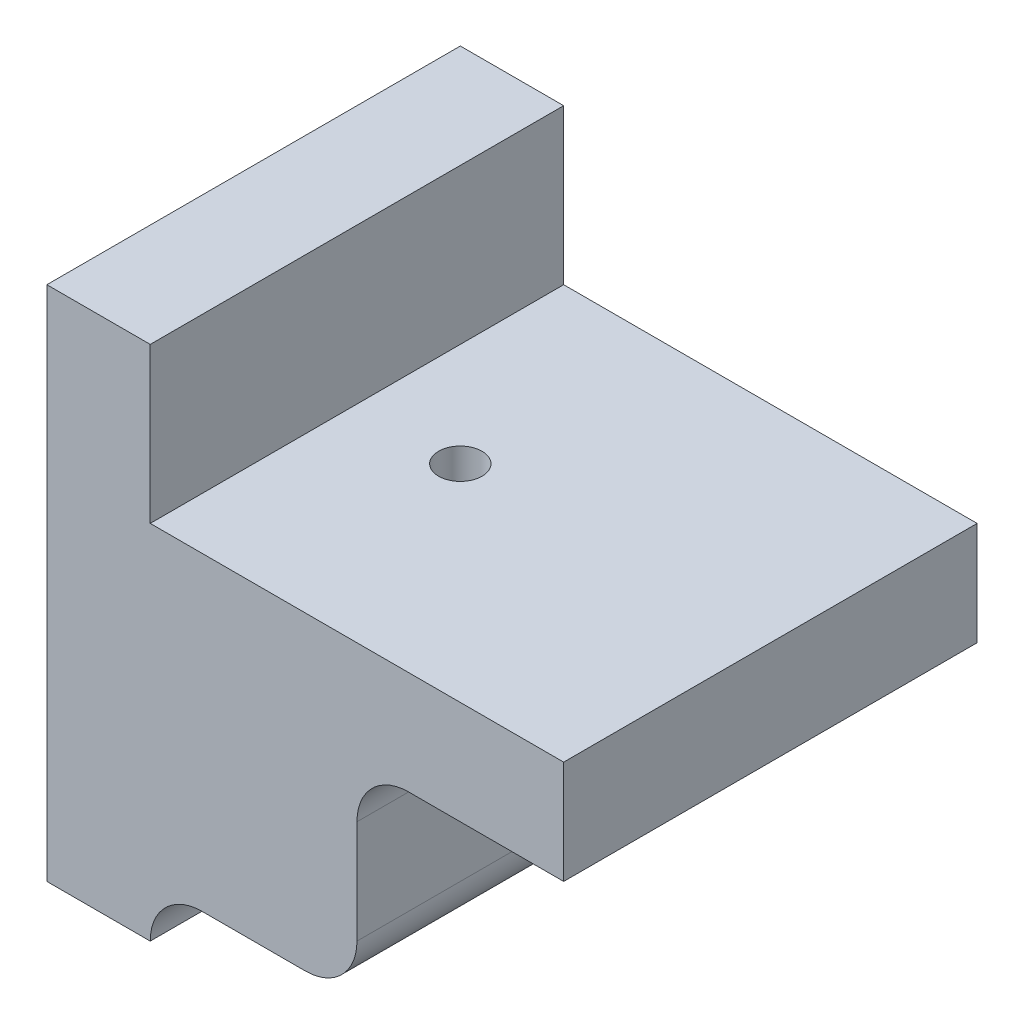
ISO-10303-21;
HEADER;
FILE_DESCRIPTION(('STEP AP214'),'2;1');
FILE_NAME('part.step','',(''),(''),'','','');
FILE_SCHEMA(('AUTOMOTIVE_DESIGN { 1 0 10303 214 1 1 1 1 }'));
ENDSEC;
DATA;
#1=APPLICATION_CONTEXT('core data for automotive mechanical design processes');
#2=APPLICATION_PROTOCOL_DEFINITION('international standard','automotive_design',2000,#1);
#3=PRODUCT_CONTEXT('',#1,'mechanical');
#4=PRODUCT('Part','Part','',(#3));
#5=PRODUCT_RELATED_PRODUCT_CATEGORY('part','',(#4));
#6=PRODUCT_DEFINITION_FORMATION('','',#4);
#7=PRODUCT_DEFINITION_CONTEXT('part definition',#1,'design');
#8=PRODUCT_DEFINITION('design','',#6,#7);
#9=PRODUCT_DEFINITION_SHAPE('','',#8);
#10=(LENGTH_UNIT() NAMED_UNIT(*) SI_UNIT(.MILLI.,.METRE.));
#11=(NAMED_UNIT(*) PLANE_ANGLE_UNIT() SI_UNIT($,.RADIAN.));
#12=(NAMED_UNIT(*) SI_UNIT($,.STERADIAN.) SOLID_ANGLE_UNIT());
#13=UNCERTAINTY_MEASURE_WITH_UNIT(LENGTH_MEASURE(1.E-05),#10,'distance_accuracy_value','');
#14=(GEOMETRIC_REPRESENTATION_CONTEXT(3) GLOBAL_UNCERTAINTY_ASSIGNED_CONTEXT((#13)) GLOBAL_UNIT_ASSIGNED_CONTEXT((#10,
#11,#12)) REPRESENTATION_CONTEXT('',''));
#15=CARTESIAN_POINT('',(0.,0.,0.));
#16=DIRECTION('',(0.,0.,1.));
#17=DIRECTION('',(1.,0.,0.));
#18=AXIS2_PLACEMENT_3D('',#15,#16,#17);
#19=CARTESIAN_POINT('',(-10.,15.,20.));
#20=DIRECTION('',(0.,-1.,0.));
#21=DIRECTION('',(0.,0.,-1.));
#22=AXIS2_PLACEMENT_3D('',#19,#20,#21);
#23=PLANE('',#22);
#24=DIRECTION('',(-1.,0.,0.));
#25=VECTOR('',#24,1.);
#26=CARTESIAN_POINT('',(-10.,15.,-20.));
#27=LINE('',#26,#25);
#28=CARTESIAN_POINT('',(-10.,15.,-20.));
#29=VERTEX_POINT('',#28);
#30=CARTESIAN_POINT('',(-20.,15.,-20.));
#31=VERTEX_POINT('',#30);
#32=EDGE_CURVE('E149',#29,#31,#27,.T.);
#33=ORIENTED_EDGE('',*,*,#32,.T.);
#34=DIRECTION('',(0.,0.,-1.));
#35=VECTOR('',#34,1.);
#36=CARTESIAN_POINT('',(-20.,15.,20.));
#37=LINE('',#36,#35);
#38=CARTESIAN_POINT('',(-20.,15.,20.));
#39=VERTEX_POINT('',#38);
#40=EDGE_CURVE('E212',#39,#31,#37,.T.);
#41=ORIENTED_EDGE('',*,*,#40,.F.);
#42=DIRECTION('',(-1.,0.,0.));
#43=VECTOR('',#42,1.);
#44=CARTESIAN_POINT('',(-10.,15.,20.));
#45=LINE('',#44,#43);
#46=CARTESIAN_POINT('',(-10.,15.,20.));
#47=VERTEX_POINT('',#46);
#48=EDGE_CURVE('E158',#47,#39,#45,.T.);
#49=ORIENTED_EDGE('',*,*,#48,.F.);
#50=DIRECTION('',(0.,0.,-1.));
#51=VECTOR('',#50,1.);
#52=CARTESIAN_POINT('',(-10.,15.,20.));
#53=LINE('',#52,#51);
#54=EDGE_CURVE('E177',#47,#29,#53,.T.);
#55=ORIENTED_EDGE('',*,*,#54,.T.);
#56=EDGE_LOOP('',(#33,#41,#49,#55));
#57=FACE_BOUND('',#56,.T.);
#58=ADVANCED_FACE('F49',(#57),#23,.F.);
#59=CARTESIAN_POINT('',(-20.,15.,20.));
#60=DIRECTION('',(1.,0.,0.));
#61=DIRECTION('',(0.,1.,0.));
#62=AXIS2_PLACEMENT_3D('',#59,#60,#61);
#63=PLANE('',#62);
#64=DIRECTION('',(0.,-1.,0.));
#65=VECTOR('',#64,1.);
#66=CARTESIAN_POINT('',(-20.,15.,-20.));
#67=LINE('',#66,#65);
#68=CARTESIAN_POINT('',(-20.,-35.,-20.));
#69=VERTEX_POINT('',#68);
#70=EDGE_CURVE('E153',#31,#69,#67,.T.);
#71=ORIENTED_EDGE('',*,*,#70,.T.);
#72=DIRECTION('',(0.,0.,-1.));
#73=VECTOR('',#72,1.);
#74=CARTESIAN_POINT('',(-20.,-35.,20.));
#75=LINE('',#74,#73);
#76=CARTESIAN_POINT('',(-20.,-35.,20.));
#77=VERTEX_POINT('',#76);
#78=EDGE_CURVE('E209',#77,#69,#75,.T.);
#79=ORIENTED_EDGE('',*,*,#78,.F.);
#80=DIRECTION('',(0.,-1.,0.));
#81=VECTOR('',#80,1.);
#82=CARTESIAN_POINT('',(-20.,15.,20.));
#83=LINE('',#82,#81);
#84=EDGE_CURVE('E161',#39,#77,#83,.T.);
#85=ORIENTED_EDGE('',*,*,#84,.F.);
#86=ORIENTED_EDGE('',*,*,#40,.T.);
#87=EDGE_LOOP('',(#71,#79,#85,#86));
#88=FACE_BOUND('',#87,.T.);
#89=ADVANCED_FACE('F270',(#88),#63,.F.);
#90=CARTESIAN_POINT('',(-20.,-35.,20.));
#91=DIRECTION('',(0.,1.,0.));
#92=DIRECTION('',(0.,0.,1.));
#93=AXIS2_PLACEMENT_3D('',#90,#91,#92);
#94=PLANE('',#93);
#95=DIRECTION('',(1.,0.,0.));
#96=VECTOR('',#95,1.);
#97=CARTESIAN_POINT('',(-20.,-35.,-20.));
#98=LINE('',#97,#96);
#99=CARTESIAN_POINT('',(-9.99999999999999,-35.,-20.));
#100=VERTEX_POINT('',#99);
#101=EDGE_CURVE('E180',#69,#100,#98,.T.);
#102=ORIENTED_EDGE('',*,*,#101,.T.);
#103=DIRECTION('',(0.,0.,-1.));
#104=VECTOR('',#103,1.);
#105=CARTESIAN_POINT('',(-9.99999999999999,-35.,20.));
#106=LINE('',#105,#104);
#107=CARTESIAN_POINT('',(-9.99999999999999,-35.,20.));
#108=VERTEX_POINT('',#107);
#109=EDGE_CURVE('E206',#108,#100,#106,.T.);
#110=ORIENTED_EDGE('',*,*,#109,.F.);
#111=DIRECTION('',(1.,0.,0.));
#112=VECTOR('',#111,1.);
#113=CARTESIAN_POINT('',(-20.,-35.,20.));
#114=LINE('',#113,#112);
#115=EDGE_CURVE('E164',#77,#108,#114,.T.);
#116=ORIENTED_EDGE('',*,*,#115,.F.);
#117=ORIENTED_EDGE('',*,*,#78,.T.);
#118=EDGE_LOOP('',(#102,#110,#116,#117));
#119=FACE_BOUND('',#118,.T.);
#120=ADVANCED_FACE('F275',(#119),#94,.F.);
#121=CARTESIAN_POINT('',(-9.99999999999999,-30.,20.));
#122=DIRECTION('',(0.,1.,0.));
#123=DIRECTION('',(0.,0.,1.));
#124=AXIS2_PLACEMENT_3D('',#121,#122,#123);
#125=PLANE('',#124);
#126=DIRECTION('',(1.,0.,0.));
#127=VECTOR('',#126,1.);
#128=CARTESIAN_POINT('',(-9.99999999999999,-30.,-20.));
#129=LINE('',#128,#127);
#130=CARTESIAN_POINT('',(-4.99999999999999,-30.,-20.));
#131=VERTEX_POINT('',#130);
#132=CARTESIAN_POINT('',(5.00000000000001,-30.,-20.));
#133=VERTEX_POINT('',#132);
#134=EDGE_CURVE('E183',#131,#133,#129,.T.);
#135=ORIENTED_EDGE('',*,*,#134,.T.);
#136=DIRECTION('',(0.,0.,-1.));
#137=VECTOR('',#136,1.);
#138=CARTESIAN_POINT('',(5.00000000000001,-30.,20.));
#139=LINE('',#138,#137);
#140=CARTESIAN_POINT('',(5.00000000000001,-30.,20.));
#141=VERTEX_POINT('',#140);
#142=EDGE_CURVE('E70',#133,#141,#139,.F.);
#143=ORIENTED_EDGE('',*,*,#142,.T.);
#144=DIRECTION('',(1.,0.,0.));
#145=VECTOR('',#144,1.);
#146=CARTESIAN_POINT('',(-9.99999999999999,-30.,20.));
#147=LINE('',#146,#145);
#148=CARTESIAN_POINT('',(-4.99999999999999,-30.,20.));
#149=VERTEX_POINT('',#148);
#150=EDGE_CURVE('E166',#149,#141,#147,.T.);
#151=ORIENTED_EDGE('',*,*,#150,.F.);
#152=DIRECTION('',(0.,0.,-1.));
#153=VECTOR('',#152,1.);
#154=CARTESIAN_POINT('',(-4.99999999999999,-30.,-20.));
#155=LINE('',#154,#153);
#156=EDGE_CURVE('E222',#149,#131,#155,.T.);
#157=ORIENTED_EDGE('',*,*,#156,.T.);
#158=EDGE_LOOP('',(#135,#143,#151,#157));
#159=FACE_BOUND('',#158,.T.);
#160=ADVANCED_FACE('F280',(#159),#125,.F.);
#161=CARTESIAN_POINT('',(10.,-30.,20.));
#162=DIRECTION('',(-1.,0.,0.));
#163=DIRECTION('',(0.,0.,1.));
#164=AXIS2_PLACEMENT_3D('',#161,#162,#163);
#165=PLANE('',#164);
#166=DIRECTION('',(0.,1.,0.));
#167=VECTOR('',#166,1.);
#168=CARTESIAN_POINT('',(10.,-30.,20.));
#169=LINE('',#168,#167);
#170=CARTESIAN_POINT('',(10.,-25.,20.));
#171=VERTEX_POINT('',#170);
#172=CARTESIAN_POINT('',(10.,-15.,20.));
#173=VERTEX_POINT('',#172);
#174=EDGE_CURVE('E168',#171,#173,#169,.T.);
#175=ORIENTED_EDGE('',*,*,#174,.F.);
#176=DIRECTION('',(0.,0.,-1.));
#177=VECTOR('',#176,1.);
#178=CARTESIAN_POINT('',(10.,-25.,20.));
#179=LINE('',#178,#177);
#180=CARTESIAN_POINT('',(10.,-25.,-20.));
#181=VERTEX_POINT('',#180);
#182=EDGE_CURVE('E217',#171,#181,#179,.T.);
#183=ORIENTED_EDGE('',*,*,#182,.T.);
#184=DIRECTION('',(0.,1.,0.));
#185=VECTOR('',#184,1.);
#186=CARTESIAN_POINT('',(10.,-30.,-20.));
#187=LINE('',#186,#185);
#188=CARTESIAN_POINT('',(10.,-15.,-20.));
#189=VERTEX_POINT('',#188);
#190=EDGE_CURVE('E185',#181,#189,#187,.T.);
#191=ORIENTED_EDGE('',*,*,#190,.T.);
#192=DIRECTION('',(0.,0.,-1.));
#193=VECTOR('',#192,1.);
#194=CARTESIAN_POINT('',(10.,-15.,20.));
#195=LINE('',#194,#193);
#196=EDGE_CURVE('E215',#189,#173,#195,.F.);
#197=ORIENTED_EDGE('',*,*,#196,.T.);
#198=EDGE_LOOP('',(#175,#183,#191,#197));
#199=FACE_BOUND('',#198,.T.);
#200=ADVANCED_FACE('F244',(#199),#165,.F.);
#201=CARTESIAN_POINT('',(10.,-10.,20.));
#202=DIRECTION('',(0.,1.,0.));
#203=DIRECTION('',(-1.,0.,0.));
#204=AXIS2_PLACEMENT_3D('',#201,#202,#203);
#205=PLANE('',#204);
#206=DIRECTION('',(1.,0.,0.));
#207=VECTOR('',#206,1.);
#208=CARTESIAN_POINT('',(10.,-10.,20.));
#209=LINE('',#208,#207);
#210=CARTESIAN_POINT('',(15.,-10.,20.));
#211=VERTEX_POINT('',#210);
#212=CARTESIAN_POINT('',(30.,-10.,20.));
#213=VERTEX_POINT('',#212);
#214=EDGE_CURVE('E170',#211,#213,#209,.T.);
#215=ORIENTED_EDGE('',*,*,#214,.F.);
#216=DIRECTION('',(0.,0.,-1.));
#217=VECTOR('',#216,1.);
#218=CARTESIAN_POINT('',(15.,-10.,-20.));
#219=LINE('',#218,#217);
#220=CARTESIAN_POINT('',(15.,-10.,-20.));
#221=VERTEX_POINT('',#220);
#222=EDGE_CURVE('E228',#211,#221,#219,.T.);
#223=ORIENTED_EDGE('',*,*,#222,.T.);
#224=DIRECTION('',(1.,0.,0.));
#225=VECTOR('',#224,1.);
#226=CARTESIAN_POINT('',(10.,-10.,-20.));
#227=LINE('',#226,#225);
#228=CARTESIAN_POINT('',(30.,-10.,-20.));
#229=VERTEX_POINT('',#228);
#230=EDGE_CURVE('E188',#221,#229,#227,.T.);
#231=ORIENTED_EDGE('',*,*,#230,.T.);
#232=DIRECTION('',(0.,0.,-1.));
#233=VECTOR('',#232,1.);
#234=CARTESIAN_POINT('',(30.,-10.,20.));
#235=LINE('',#234,#233);
#236=EDGE_CURVE('E203',#213,#229,#235,.T.);
#237=ORIENTED_EDGE('',*,*,#236,.F.);
#238=EDGE_LOOP('',(#215,#223,#231,#237));
#239=FACE_BOUND('',#238,.T.);
#240=ADVANCED_FACE('F247',(#239),#205,.F.);
#241=CARTESIAN_POINT('',(30.,-10.,20.));
#242=DIRECTION('',(-1.,0.,0.));
#243=DIRECTION('',(0.,0.,1.));
#244=AXIS2_PLACEMENT_3D('',#241,#242,#243);
#245=PLANE('',#244);
#246=DIRECTION('',(0.,1.,0.));
#247=VECTOR('',#246,1.);
#248=CARTESIAN_POINT('',(30.,-10.,-20.));
#249=LINE('',#248,#247);
#250=CARTESIAN_POINT('',(30.,0.,-20.));
#251=VERTEX_POINT('',#250);
#252=EDGE_CURVE('E190',#229,#251,#249,.T.);
#253=ORIENTED_EDGE('',*,*,#252,.T.);
#254=DIRECTION('',(0.,0.,-1.));
#255=VECTOR('',#254,1.);
#256=CARTESIAN_POINT('',(30.,0.,20.));
#257=LINE('',#256,#255);
#258=CARTESIAN_POINT('',(30.,0.,20.));
#259=VERTEX_POINT('',#258);
#260=EDGE_CURVE('E200',#259,#251,#257,.T.);
#261=ORIENTED_EDGE('',*,*,#260,.F.);
#262=DIRECTION('',(0.,1.,0.));
#263=VECTOR('',#262,1.);
#264=CARTESIAN_POINT('',(30.,-10.,20.));
#265=LINE('',#264,#263);
#266=EDGE_CURVE('E172',#213,#259,#265,.T.);
#267=ORIENTED_EDGE('',*,*,#266,.F.);
#268=ORIENTED_EDGE('',*,*,#236,.T.);
#269=EDGE_LOOP('',(#253,#261,#267,#268));
#270=FACE_BOUND('',#269,.T.);
#271=ADVANCED_FACE('F255',(#270),#245,.F.);
#272=CARTESIAN_POINT('',(30.,0.,20.));
#273=DIRECTION('',(0.,-1.,0.));
#274=DIRECTION('',(1.,0.,0.));
#275=AXIS2_PLACEMENT_3D('',#272,#273,#274);
#276=PLANE('',#275);
#277=CARTESIAN_POINT('',(0.,0.,0.));
#278=DIRECTION('',(0.,1.,0.));
#279=DIRECTION('',(0.,0.,1.));
#280=AXIS2_PLACEMENT_3D('',#277,#278,#279);
#281=CIRCLE('',#280,2.09999999999999);
#282=CARTESIAN_POINT('',(0.,0.,2.09999999999999));
#283=VERTEX_POINT('',#282);
#284=EDGE_CURVE('E150',#283,#283,#281,.T.);
#285=ORIENTED_EDGE('',*,*,#284,.F.);
#286=EDGE_LOOP('',(#285));
#287=FACE_BOUND('',#286,.T.);
#288=DIRECTION('',(-1.,0.,0.));
#289=VECTOR('',#288,1.);
#290=CARTESIAN_POINT('',(30.,0.,-20.));
#291=LINE('',#290,#289);
#292=CARTESIAN_POINT('',(-10.,0.,-20.));
#293=VERTEX_POINT('',#292);
#294=EDGE_CURVE('E192',#251,#293,#291,.T.);
#295=ORIENTED_EDGE('',*,*,#294,.T.);
#296=DIRECTION('',(0.,0.,-1.));
#297=VECTOR('',#296,1.);
#298=CARTESIAN_POINT('',(-10.,0.,20.));
#299=LINE('',#298,#297);
#300=CARTESIAN_POINT('',(-10.,0.,20.));
#301=VERTEX_POINT('',#300);
#302=EDGE_CURVE('E197',#301,#293,#299,.T.);
#303=ORIENTED_EDGE('',*,*,#302,.F.);
#304=DIRECTION('',(-1.,0.,0.));
#305=VECTOR('',#304,1.);
#306=CARTESIAN_POINT('',(30.,0.,20.));
#307=LINE('',#306,#305);
#308=EDGE_CURVE('E174',#259,#301,#307,.T.);
#309=ORIENTED_EDGE('',*,*,#308,.F.);
#310=ORIENTED_EDGE('',*,*,#260,.T.);
#311=EDGE_LOOP('',(#295,#303,#309,#310));
#312=FACE_BOUND('',#311,.T.);
#313=ADVANCED_FACE('F258',(#287,#312),#276,.F.);
#314=CARTESIAN_POINT('',(-10.,0.,20.));
#315=DIRECTION('',(-1.,0.,0.));
#316=DIRECTION('',(0.,-1.,0.));
#317=AXIS2_PLACEMENT_3D('',#314,#315,#316);
#318=PLANE('',#317);
#319=DIRECTION('',(0.,1.,0.));
#320=VECTOR('',#319,1.);
#321=CARTESIAN_POINT('',(-10.,0.,-20.));
#322=LINE('',#321,#320);
#323=EDGE_CURVE('E162',#293,#29,#322,.T.);
#324=ORIENTED_EDGE('',*,*,#323,.T.);
#325=ORIENTED_EDGE('',*,*,#54,.F.);
#326=DIRECTION('',(0.,1.,0.));
#327=VECTOR('',#326,1.);
#328=CARTESIAN_POINT('',(-10.,0.,20.));
#329=LINE('',#328,#327);
#330=EDGE_CURVE('E176',#301,#47,#329,.T.);
#331=ORIENTED_EDGE('',*,*,#330,.F.);
#332=ORIENTED_EDGE('',*,*,#302,.T.);
#333=EDGE_LOOP('',(#324,#325,#331,#332));
#334=FACE_BOUND('',#333,.T.);
#335=ADVANCED_FACE('F263',(#334),#318,.F.);
#336=CARTESIAN_POINT('',(0.,0.,20.));
#337=DIRECTION('',(0.,0.,1.));
#338=DIRECTION('',(1.,0.,0.));
#339=AXIS2_PLACEMENT_3D('',#336,#337,#338);
#340=PLANE('',#339);
#341=ORIENTED_EDGE('',*,*,#150,.T.);
#342=CARTESIAN_POINT('',(5.00000000000001,-25.,20.));
#343=DIRECTION('',(0.,0.,1.));
#344=DIRECTION('',(1.,0.,0.));
#345=AXIS2_PLACEMENT_3D('',#342,#343,#344);
#346=CIRCLE('',#345,5.);
#347=EDGE_CURVE('E226',#141,#171,#346,.T.);
#348=ORIENTED_EDGE('',*,*,#347,.T.);
#349=ORIENTED_EDGE('',*,*,#174,.T.);
#350=CARTESIAN_POINT('',(15.,-15.,20.));
#351=DIRECTION('',(0.,0.,1.));
#352=DIRECTION('',(1.,0.,0.));
#353=AXIS2_PLACEMENT_3D('',#350,#351,#352);
#354=CIRCLE('',#353,5.);
#355=EDGE_CURVE('E13',#173,#211,#354,.F.);
#356=ORIENTED_EDGE('',*,*,#355,.T.);
#357=ORIENTED_EDGE('',*,*,#214,.T.);
#358=ORIENTED_EDGE('',*,*,#266,.T.);
#359=ORIENTED_EDGE('',*,*,#308,.T.);
#360=ORIENTED_EDGE('',*,*,#330,.T.);
#361=ORIENTED_EDGE('',*,*,#48,.T.);
#362=ORIENTED_EDGE('',*,*,#84,.T.);
#363=ORIENTED_EDGE('',*,*,#115,.T.);
#364=CARTESIAN_POINT('',(-4.99999999999999,-35.,20.));
#365=DIRECTION('',(0.,0.,1.));
#366=DIRECTION('',(1.,0.,0.));
#367=AXIS2_PLACEMENT_3D('',#364,#365,#366);
#368=CIRCLE('',#367,5.);
#369=EDGE_CURVE('E233',#108,#149,#368,.F.);
#370=ORIENTED_EDGE('',*,*,#369,.T.);
#371=EDGE_LOOP('',(#341,#348,#349,#356,#357,#358,#359,#360,#361,#362,#363,#370));
#372=FACE_BOUND('',#371,.T.);
#373=ADVANCED_FACE('F250',(#372),#340,.T.);
#374=CARTESIAN_POINT('',(0.,0.,-20.));
#375=DIRECTION('',(0.,0.,1.));
#376=DIRECTION('',(1.,0.,0.));
#377=AXIS2_PLACEMENT_3D('',#374,#375,#376);
#378=PLANE('',#377);
#379=ORIENTED_EDGE('',*,*,#190,.F.);
#380=CARTESIAN_POINT('',(5.00000000000001,-25.,-20.));
#381=DIRECTION('',(0.,0.,1.));
#382=DIRECTION('',(1.,0.,0.));
#383=AXIS2_PLACEMENT_3D('',#380,#381,#382);
#384=CIRCLE('',#383,5.);
#385=EDGE_CURVE('E220',#181,#133,#384,.F.);
#386=ORIENTED_EDGE('',*,*,#385,.T.);
#387=ORIENTED_EDGE('',*,*,#134,.F.);
#388=CARTESIAN_POINT('',(-4.99999999999999,-35.,-20.));
#389=DIRECTION('',(0.,0.,1.));
#390=DIRECTION('',(1.,0.,0.));
#391=AXIS2_PLACEMENT_3D('',#388,#389,#390);
#392=CIRCLE('',#391,5.);
#393=EDGE_CURVE('E231',#131,#100,#392,.T.);
#394=ORIENTED_EDGE('',*,*,#393,.T.);
#395=ORIENTED_EDGE('',*,*,#101,.F.);
#396=ORIENTED_EDGE('',*,*,#70,.F.);
#397=ORIENTED_EDGE('',*,*,#32,.F.);
#398=ORIENTED_EDGE('',*,*,#323,.F.);
#399=ORIENTED_EDGE('',*,*,#294,.F.);
#400=ORIENTED_EDGE('',*,*,#252,.F.);
#401=ORIENTED_EDGE('',*,*,#230,.F.);
#402=CARTESIAN_POINT('',(15.,-15.,-20.));
#403=DIRECTION('',(0.,0.,1.));
#404=DIRECTION('',(1.,0.,0.));
#405=AXIS2_PLACEMENT_3D('',#402,#403,#404);
#406=CIRCLE('',#405,5.);
#407=EDGE_CURVE('E57',#221,#189,#406,.T.);
#408=ORIENTED_EDGE('',*,*,#407,.T.);
#409=EDGE_LOOP('',(#379,#386,#387,#394,#395,#396,#397,#398,#399,#400,#401,#408));
#410=FACE_BOUND('',#409,.T.);
#411=ADVANCED_FACE('F237',(#410),#378,.F.);
#412=CARTESIAN_POINT('',(5.00000000000001,-25.,20.));
#413=DIRECTION('',(0.,0.,-1.));
#414=DIRECTION('',(-1.,0.,0.));
#415=AXIS2_PLACEMENT_3D('',#412,#413,#414);
#416=CYLINDRICAL_SURFACE('',#415,5.);
#417=ORIENTED_EDGE('',*,*,#347,.F.);
#418=ORIENTED_EDGE('',*,*,#142,.F.);
#419=ORIENTED_EDGE('',*,*,#385,.F.);
#420=ORIENTED_EDGE('',*,*,#182,.F.);
#421=EDGE_LOOP('',(#417,#418,#419,#420));
#422=FACE_BOUND('',#421,.T.);
#423=ADVANCED_FACE('F284',(#422),#416,.T.);
#424=CARTESIAN_POINT('',(-4.99999999999999,-35.,20.));
#425=DIRECTION('',(0.,0.,1.));
#426=DIRECTION('',(1.,0.,0.));
#427=AXIS2_PLACEMENT_3D('',#424,#425,#426);
#428=CYLINDRICAL_SURFACE('',#427,5.);
#429=ORIENTED_EDGE('',*,*,#369,.F.);
#430=ORIENTED_EDGE('',*,*,#109,.T.);
#431=ORIENTED_EDGE('',*,*,#393,.F.);
#432=ORIENTED_EDGE('',*,*,#156,.F.);
#433=EDGE_LOOP('',(#429,#430,#431,#432));
#434=FACE_BOUND('',#433,.T.);
#435=ADVANCED_FACE('F282',(#434),#428,.F.);
#436=CARTESIAN_POINT('',(15.,-15.,20.));
#437=DIRECTION('',(0.,0.,1.));
#438=DIRECTION('',(1.,0.,0.));
#439=AXIS2_PLACEMENT_3D('',#436,#437,#438);
#440=CYLINDRICAL_SURFACE('',#439,5.);
#441=ORIENTED_EDGE('',*,*,#355,.F.);
#442=ORIENTED_EDGE('',*,*,#196,.F.);
#443=ORIENTED_EDGE('',*,*,#407,.F.);
#444=ORIENTED_EDGE('',*,*,#222,.F.);
#445=EDGE_LOOP('',(#441,#442,#443,#444));
#446=FACE_BOUND('',#445,.T.);
#447=ADVANCED_FACE('F51',(#446),#440,.F.);
#448=CARTESIAN_POINT('',(0.,-25.,0.));
#449=DIRECTION('',(0.,1.,0.));
#450=DIRECTION('',(0.,0.,1.));
#451=AXIS2_PLACEMENT_3D('',#448,#449,#450);
#452=CONICAL_SURFACE('',#451,2.1,1.02974425867665);
#453=CARTESIAN_POINT('',(0.,-26.2618072999579,0.));
#454=VERTEX_POINT('',#453);
#455=VERTEX_LOOP('',#454);
#456=FACE_BOUND('',#455,.T.);
#457=CARTESIAN_POINT('',(0.,-25.,0.));
#458=DIRECTION('',(0.,1.,0.));
#459=DIRECTION('',(0.,0.,1.));
#460=AXIS2_PLACEMENT_3D('',#457,#458,#459);
#461=CIRCLE('',#460,2.1);
#462=CARTESIAN_POINT('',(0.,-25.,2.1));
#463=VERTEX_POINT('',#462);
#464=EDGE_CURVE('E147',#463,#463,#461,.T.);
#465=ORIENTED_EDGE('',*,*,#464,.T.);
#466=EDGE_LOOP('',(#465));
#467=FACE_BOUND('',#466,.T.);
#468=ADVANCED_FACE('F140',(#456,#467),#452,.F.);
#469=CARTESIAN_POINT('',(0.,0.,0.));
#470=DIRECTION('',(0.,1.,0.));
#471=DIRECTION('',(0.,0.,1.));
#472=AXIS2_PLACEMENT_3D('',#469,#470,#471);
#473=CYLINDRICAL_SURFACE('',#472,2.09999999999999);
#474=ORIENTED_EDGE('',*,*,#464,.F.);
#475=EDGE_LOOP('',(#474));
#476=FACE_BOUND('',#475,.T.);
#477=ORIENTED_EDGE('',*,*,#284,.T.);
#478=EDGE_LOOP('',(#477));
#479=FACE_BOUND('',#478,.T.);
#480=ADVANCED_FACE('F143',(#476,#479),#473,.F.);
#481=CLOSED_SHELL('',(#58,#89,#120,#160,#200,#240,#271,#313,#335,#373,#411,#423,#435,#447,#468,#480));
#482=MANIFOLD_SOLID_BREP('B2',#481);
#483=ADVANCED_BREP_SHAPE_REPRESENTATION('',(#18,#482),#14);
#484=SHAPE_DEFINITION_REPRESENTATION(#9,#483);
ENDSEC;
END-ISO-10303-21;
